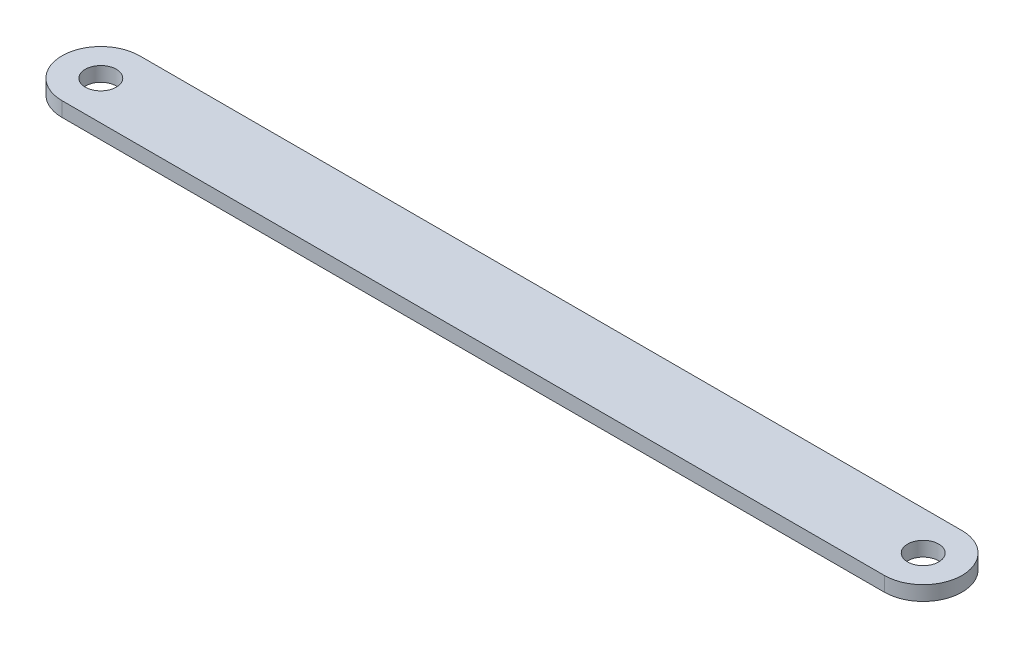
ISO-10303-21;
HEADER;
FILE_DESCRIPTION(('STEP AP214'),'2;1');
FILE_NAME('part.step','',(''),(''),'','','');
FILE_SCHEMA(('AUTOMOTIVE_DESIGN { 1 0 10303 214 1 1 1 1 }'));
ENDSEC;
DATA;
#1=APPLICATION_CONTEXT('core data for automotive mechanical design processes');
#2=APPLICATION_PROTOCOL_DEFINITION('international standard','automotive_design',2000,#1);
#3=PRODUCT_CONTEXT('',#1,'mechanical');
#4=PRODUCT('Part','Part','',(#3));
#5=PRODUCT_RELATED_PRODUCT_CATEGORY('part','',(#4));
#6=PRODUCT_DEFINITION_FORMATION('','',#4);
#7=PRODUCT_DEFINITION_CONTEXT('part definition',#1,'design');
#8=PRODUCT_DEFINITION('design','',#6,#7);
#9=PRODUCT_DEFINITION_SHAPE('','',#8);
#10=(LENGTH_UNIT() NAMED_UNIT(*) SI_UNIT(.MILLI.,.METRE.));
#11=(NAMED_UNIT(*) PLANE_ANGLE_UNIT() SI_UNIT($,.RADIAN.));
#12=(NAMED_UNIT(*) SI_UNIT($,.STERADIAN.) SOLID_ANGLE_UNIT());
#13=UNCERTAINTY_MEASURE_WITH_UNIT(LENGTH_MEASURE(1.E-05),#10,'distance_accuracy_value','');
#14=(GEOMETRIC_REPRESENTATION_CONTEXT(3) GLOBAL_UNCERTAINTY_ASSIGNED_CONTEXT((#13)) GLOBAL_UNIT_ASSIGNED_CONTEXT((#10,
#11,#12)) REPRESENTATION_CONTEXT('',''));
#15=CARTESIAN_POINT('',(0.,0.,0.));
#16=DIRECTION('',(0.,0.,1.));
#17=DIRECTION('',(1.,0.,0.));
#18=AXIS2_PLACEMENT_3D('',#15,#16,#17);
#19=CARTESIAN_POINT('',(-42.35,1.5,0.));
#20=DIRECTION('',(0.,1.,0.));
#21=DIRECTION('',(0.,0.,1.));
#22=AXIS2_PLACEMENT_3D('',#19,#20,#21);
#23=PLANE('',#22);
#24=CARTESIAN_POINT('',(-42.35,1.5,0.));
#25=DIRECTION('',(0.,1.,0.));
#26=DIRECTION('',(0.,0.,1.));
#27=AXIS2_PLACEMENT_3D('',#24,#25,#26);
#28=CIRCLE('',#27,1.6);
#29=CARTESIAN_POINT('',(-42.35,1.5,1.6));
#30=VERTEX_POINT('',#29);
#31=EDGE_CURVE('E118',#30,#30,#28,.T.);
#32=ORIENTED_EDGE('',*,*,#31,.F.);
#33=EDGE_LOOP('',(#32));
#34=FACE_BOUND('',#33,.T.);
#35=CARTESIAN_POINT('',(-42.35,1.5,0.));
#36=DIRECTION('',(0.,1.,0.));
#37=DIRECTION('',(0.,0.,1.));
#38=AXIS2_PLACEMENT_3D('',#35,#36,#37);
#39=CIRCLE('',#38,4.);
#40=CARTESIAN_POINT('',(-42.35,1.5,-4.));
#41=VERTEX_POINT('',#40);
#42=CARTESIAN_POINT('',(-42.35,1.5,4.));
#43=VERTEX_POINT('',#42);
#44=EDGE_CURVE('E98',#41,#43,#39,.T.);
#45=ORIENTED_EDGE('',*,*,#44,.T.);
#46=DIRECTION('',(1.,0.,0.));
#47=VECTOR('',#46,1.);
#48=CARTESIAN_POINT('',(-42.35,1.5,4.));
#49=LINE('',#48,#47);
#50=CARTESIAN_POINT('',(42.35,1.5,3.99999999999998));
#51=VERTEX_POINT('',#50);
#52=EDGE_CURVE('E93',#43,#51,#49,.T.);
#53=ORIENTED_EDGE('',*,*,#52,.T.);
#54=CARTESIAN_POINT('',(42.35,1.5,0.));
#55=DIRECTION('',(0.,1.,0.));
#56=DIRECTION('',(0.,0.,1.));
#57=AXIS2_PLACEMENT_3D('',#54,#55,#56);
#58=CIRCLE('',#57,4.);
#59=CARTESIAN_POINT('',(42.35,1.5,-4.00000000000002));
#60=VERTEX_POINT('',#59);
#61=EDGE_CURVE('E96',#51,#60,#58,.T.);
#62=ORIENTED_EDGE('',*,*,#61,.T.);
#63=DIRECTION('',(-1.,0.,0.));
#64=VECTOR('',#63,1.);
#65=CARTESIAN_POINT('',(-42.35,1.5,-4.));
#66=LINE('',#65,#64);
#67=EDGE_CURVE('E63',#60,#41,#66,.T.);
#68=ORIENTED_EDGE('',*,*,#67,.T.);
#69=EDGE_LOOP('',(#45,#53,#62,#68));
#70=FACE_BOUND('',#69,.T.);
#71=CARTESIAN_POINT('',(42.35,1.5,0.));
#72=DIRECTION('',(0.,1.,0.));
#73=DIRECTION('',(0.,0.,1.));
#74=AXIS2_PLACEMENT_3D('',#71,#72,#73);
#75=CIRCLE('',#74,1.6);
#76=CARTESIAN_POINT('',(42.35,1.5,1.59999999999998));
#77=VERTEX_POINT('',#76);
#78=EDGE_CURVE('E140',#77,#77,#75,.T.);
#79=ORIENTED_EDGE('',*,*,#78,.F.);
#80=EDGE_LOOP('',(#79));
#81=FACE_BOUND('',#80,.T.);
#82=ADVANCED_FACE('F45',(#34,#70,#81),#23,.T.);
#83=CARTESIAN_POINT('',(-42.35,0.,0.));
#84=DIRECTION('',(0.,1.,0.));
#85=DIRECTION('',(0.,0.,1.));
#86=AXIS2_PLACEMENT_3D('',#83,#84,#85);
#87=PLANE('',#86);
#88=CARTESIAN_POINT('',(-42.35,0.,0.));
#89=DIRECTION('',(0.,1.,0.));
#90=DIRECTION('',(0.,0.,1.));
#91=AXIS2_PLACEMENT_3D('',#88,#89,#90);
#92=CIRCLE('',#91,4.);
#93=CARTESIAN_POINT('',(-42.35,0.,-4.));
#94=VERTEX_POINT('',#93);
#95=CARTESIAN_POINT('',(-42.35,0.,4.));
#96=VERTEX_POINT('',#95);
#97=EDGE_CURVE('E114',#94,#96,#92,.T.);
#98=ORIENTED_EDGE('',*,*,#97,.F.);
#99=DIRECTION('',(-1.,0.,0.));
#100=VECTOR('',#99,1.);
#101=CARTESIAN_POINT('',(-42.35,0.,-4.));
#102=LINE('',#101,#100);
#103=CARTESIAN_POINT('',(42.35,0.,-4.00000000000002));
#104=VERTEX_POINT('',#103);
#105=EDGE_CURVE('E86',#104,#94,#102,.T.);
#106=ORIENTED_EDGE('',*,*,#105,.F.);
#107=CARTESIAN_POINT('',(42.35,0.,0.));
#108=DIRECTION('',(0.,1.,0.));
#109=DIRECTION('',(0.,0.,1.));
#110=AXIS2_PLACEMENT_3D('',#107,#108,#109);
#111=CIRCLE('',#110,4.);
#112=CARTESIAN_POINT('',(42.35,0.,3.99999999999998));
#113=VERTEX_POINT('',#112);
#114=EDGE_CURVE('E80',#113,#104,#111,.T.);
#115=ORIENTED_EDGE('',*,*,#114,.F.);
#116=DIRECTION('',(1.,0.,0.));
#117=VECTOR('',#116,1.);
#118=CARTESIAN_POINT('',(-42.35,0.,4.));
#119=LINE('',#118,#117);
#120=EDGE_CURVE('E103',#96,#113,#119,.T.);
#121=ORIENTED_EDGE('',*,*,#120,.F.);
#122=EDGE_LOOP('',(#98,#106,#115,#121));
#123=FACE_BOUND('',#122,.T.);
#124=CARTESIAN_POINT('',(-42.35,0.,0.));
#125=DIRECTION('',(0.,1.,0.));
#126=DIRECTION('',(0.,0.,1.));
#127=AXIS2_PLACEMENT_3D('',#124,#125,#126);
#128=CIRCLE('',#127,1.6);
#129=CARTESIAN_POINT('',(-42.35,0.,1.6));
#130=VERTEX_POINT('',#129);
#131=EDGE_CURVE('E136',#130,#130,#128,.T.);
#132=ORIENTED_EDGE('',*,*,#131,.T.);
#133=EDGE_LOOP('',(#132));
#134=FACE_BOUND('',#133,.T.);
#135=CARTESIAN_POINT('',(42.35,0.,0.));
#136=DIRECTION('',(0.,1.,0.));
#137=DIRECTION('',(0.,0.,1.));
#138=AXIS2_PLACEMENT_3D('',#135,#136,#137);
#139=CIRCLE('',#138,1.6);
#140=CARTESIAN_POINT('',(42.35,0.,1.59999999999998));
#141=VERTEX_POINT('',#140);
#142=EDGE_CURVE('E144',#141,#141,#139,.T.);
#143=ORIENTED_EDGE('',*,*,#142,.T.);
#144=EDGE_LOOP('',(#143));
#145=FACE_BOUND('',#144,.T.);
#146=ADVANCED_FACE('F131',(#123,#134,#145),#87,.F.);
#147=CARTESIAN_POINT('',(-42.35,1.5,0.));
#148=DIRECTION('',(0.,-1.,0.));
#149=DIRECTION('',(0.,0.,-1.));
#150=AXIS2_PLACEMENT_3D('',#147,#148,#149);
#151=CYLINDRICAL_SURFACE('',#150,4.);
#152=ORIENTED_EDGE('',*,*,#97,.T.);
#153=DIRECTION('',(0.,-1.,0.));
#154=VECTOR('',#153,1.);
#155=CARTESIAN_POINT('',(-42.35,1.5,4.));
#156=LINE('',#155,#154);
#157=EDGE_CURVE('E11',#43,#96,#156,.T.);
#158=ORIENTED_EDGE('',*,*,#157,.F.);
#159=ORIENTED_EDGE('',*,*,#44,.F.);
#160=DIRECTION('',(0.,-1.,0.));
#161=VECTOR('',#160,1.);
#162=CARTESIAN_POINT('',(-42.35,1.5,-4.));
#163=LINE('',#162,#161);
#164=EDGE_CURVE('E110',#41,#94,#163,.T.);
#165=ORIENTED_EDGE('',*,*,#164,.T.);
#166=EDGE_LOOP('',(#152,#158,#159,#165));
#167=FACE_BOUND('',#166,.T.);
#168=ADVANCED_FACE('F47',(#167),#151,.T.);
#169=CARTESIAN_POINT('',(-42.35,1.5,4.));
#170=DIRECTION('',(0.,0.,-1.));
#171=DIRECTION('',(-1.,0.,0.));
#172=AXIS2_PLACEMENT_3D('',#169,#170,#171);
#173=PLANE('',#172);
#174=ORIENTED_EDGE('',*,*,#120,.T.);
#175=DIRECTION('',(0.,-1.,0.));
#176=VECTOR('',#175,1.);
#177=CARTESIAN_POINT('',(42.35,1.5,3.99999999999998));
#178=LINE('',#177,#176);
#179=EDGE_CURVE('E55',#51,#113,#178,.T.);
#180=ORIENTED_EDGE('',*,*,#179,.F.);
#181=ORIENTED_EDGE('',*,*,#52,.F.);
#182=ORIENTED_EDGE('',*,*,#157,.T.);
#183=EDGE_LOOP('',(#174,#180,#181,#182));
#184=FACE_BOUND('',#183,.T.);
#185=ADVANCED_FACE('F102',(#184),#173,.F.);
#186=CARTESIAN_POINT('',(42.35,1.5,0.));
#187=DIRECTION('',(0.,-1.,0.));
#188=DIRECTION('',(0.,0.,-1.));
#189=AXIS2_PLACEMENT_3D('',#186,#187,#188);
#190=CYLINDRICAL_SURFACE('',#189,4.);
#191=ORIENTED_EDGE('',*,*,#114,.T.);
#192=DIRECTION('',(0.,-1.,0.));
#193=VECTOR('',#192,1.);
#194=CARTESIAN_POINT('',(42.35,1.5,-4.00000000000002));
#195=LINE('',#194,#193);
#196=EDGE_CURVE('E105',#60,#104,#195,.T.);
#197=ORIENTED_EDGE('',*,*,#196,.F.);
#198=ORIENTED_EDGE('',*,*,#61,.F.);
#199=ORIENTED_EDGE('',*,*,#179,.T.);
#200=EDGE_LOOP('',(#191,#197,#198,#199));
#201=FACE_BOUND('',#200,.T.);
#202=ADVANCED_FACE('F106',(#201),#190,.T.);
#203=CARTESIAN_POINT('',(-42.35,1.5,-4.));
#204=DIRECTION('',(0.,0.,1.));
#205=DIRECTION('',(1.,0.,0.));
#206=AXIS2_PLACEMENT_3D('',#203,#204,#205);
#207=PLANE('',#206);
#208=ORIENTED_EDGE('',*,*,#105,.T.);
#209=ORIENTED_EDGE('',*,*,#164,.F.);
#210=ORIENTED_EDGE('',*,*,#67,.F.);
#211=ORIENTED_EDGE('',*,*,#196,.T.);
#212=EDGE_LOOP('',(#208,#209,#210,#211));
#213=FACE_BOUND('',#212,.T.);
#214=ADVANCED_FACE('F128',(#213),#207,.F.);
#215=CARTESIAN_POINT('',(-42.35,1.5,0.));
#216=DIRECTION('',(0.,-1.,0.));
#217=DIRECTION('',(0.,0.,-1.));
#218=AXIS2_PLACEMENT_3D('',#215,#216,#217);
#219=CYLINDRICAL_SURFACE('',#218,1.6);
#220=ORIENTED_EDGE('',*,*,#31,.T.);
#221=EDGE_LOOP('',(#220));
#222=FACE_BOUND('',#221,.T.);
#223=ORIENTED_EDGE('',*,*,#131,.F.);
#224=EDGE_LOOP('',(#223));
#225=FACE_BOUND('',#224,.T.);
#226=ADVANCED_FACE('F163',(#222,#225),#219,.F.);
#227=CARTESIAN_POINT('',(42.35,1.5,0.));
#228=DIRECTION('',(0.,-1.,0.));
#229=DIRECTION('',(0.,0.,-1.));
#230=AXIS2_PLACEMENT_3D('',#227,#228,#229);
#231=CYLINDRICAL_SURFACE('',#230,1.6);
#232=ORIENTED_EDGE('',*,*,#78,.T.);
#233=EDGE_LOOP('',(#232));
#234=FACE_BOUND('',#233,.T.);
#235=ORIENTED_EDGE('',*,*,#142,.F.);
#236=EDGE_LOOP('',(#235));
#237=FACE_BOUND('',#236,.T.);
#238=ADVANCED_FACE('F152',(#234,#237),#231,.F.);
#239=CLOSED_SHELL('',(#82,#146,#168,#185,#202,#214,#226,#238));
#240=MANIFOLD_SOLID_BREP('B2',#239);
#241=ADVANCED_BREP_SHAPE_REPRESENTATION('',(#18,#240),#14);
#242=SHAPE_DEFINITION_REPRESENTATION(#9,#241);
ENDSEC;
END-ISO-10303-21;
